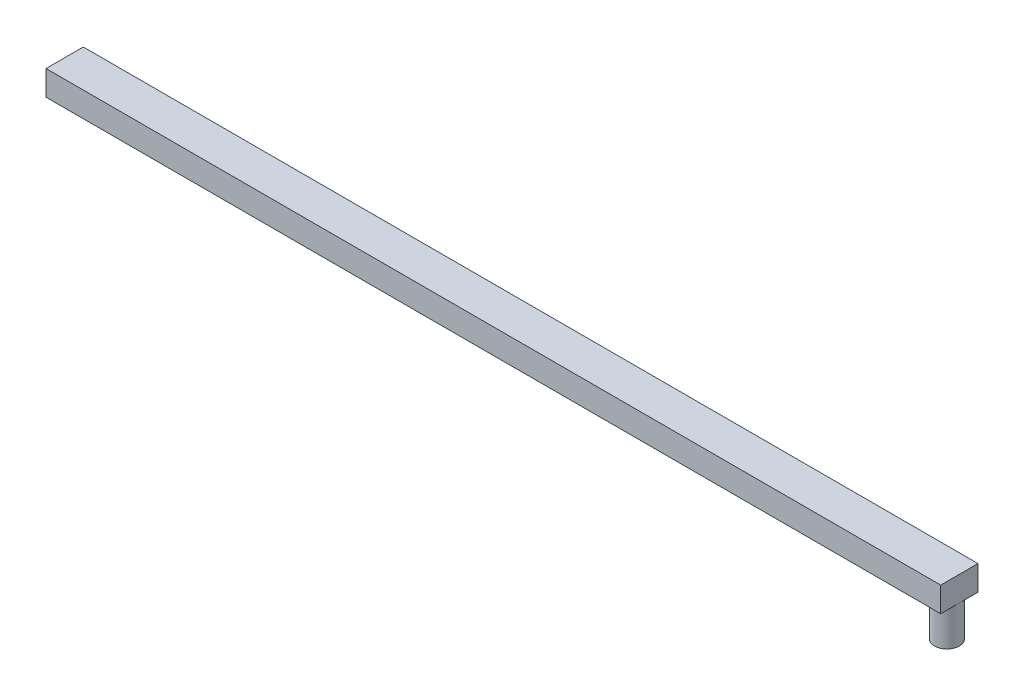
ISO-10303-21;
HEADER;
FILE_DESCRIPTION(('STEP AP214'),'2;1');
FILE_NAME('part.step','',(''),(''),'','','');
FILE_SCHEMA(('AUTOMOTIVE_DESIGN { 1 0 10303 214 1 1 1 1 }'));
ENDSEC;
DATA;
#1=APPLICATION_CONTEXT('core data for automotive mechanical design processes');
#2=APPLICATION_PROTOCOL_DEFINITION('international standard','automotive_design',2000,#1);
#3=PRODUCT_CONTEXT('',#1,'mechanical');
#4=PRODUCT('Part','Part','',(#3));
#5=PRODUCT_RELATED_PRODUCT_CATEGORY('part','',(#4));
#6=PRODUCT_DEFINITION_FORMATION('','',#4);
#7=PRODUCT_DEFINITION_CONTEXT('part definition',#1,'design');
#8=PRODUCT_DEFINITION('design','',#6,#7);
#9=PRODUCT_DEFINITION_SHAPE('','',#8);
#10=(LENGTH_UNIT() NAMED_UNIT(*) SI_UNIT(.MILLI.,.METRE.));
#11=(NAMED_UNIT(*) PLANE_ANGLE_UNIT() SI_UNIT($,.RADIAN.));
#12=(NAMED_UNIT(*) SI_UNIT($,.STERADIAN.) SOLID_ANGLE_UNIT());
#13=UNCERTAINTY_MEASURE_WITH_UNIT(LENGTH_MEASURE(1.E-05),#10,'distance_accuracy_value','');
#14=(GEOMETRIC_REPRESENTATION_CONTEXT(3) GLOBAL_UNCERTAINTY_ASSIGNED_CONTEXT((#13)) GLOBAL_UNIT_ASSIGNED_CONTEXT((#10,
#11,#12)) REPRESENTATION_CONTEXT('',''));
#15=CARTESIAN_POINT('',(0.,0.,0.));
#16=DIRECTION('',(0.,0.,1.));
#17=DIRECTION('',(1.,0.,0.));
#18=AXIS2_PLACEMENT_3D('',#15,#16,#17);
#19=CARTESIAN_POINT('',(0.,3.,0.));
#20=DIRECTION('',(0.,-1.,0.));
#21=DIRECTION('',(0.,0.,-1.));
#22=AXIS2_PLACEMENT_3D('',#19,#20,#21);
#23=CYLINDRICAL_SURFACE('',#22,1.);
#24=CARTESIAN_POINT('',(0.,3.,0.));
#25=DIRECTION('',(0.,1.,0.));
#26=DIRECTION('',(0.,0.,1.));
#27=AXIS2_PLACEMENT_3D('',#24,#25,#26);
#28=CIRCLE('',#27,1.);
#29=CARTESIAN_POINT('',(1.,3.,0.));
#30=VERTEX_POINT('',#29);
#31=EDGE_CURVE('E11',#30,#30,#28,.T.);
#32=ORIENTED_EDGE('',*,*,#31,.F.);
#33=EDGE_LOOP('',(#32));
#34=FACE_BOUND('',#33,.T.);
#35=CARTESIAN_POINT('',(0.,0.,0.));
#36=DIRECTION('',(0.,1.,0.));
#37=DIRECTION('',(0.,0.,1.));
#38=AXIS2_PLACEMENT_3D('',#35,#36,#37);
#39=CIRCLE('',#38,1.);
#40=CARTESIAN_POINT('',(0.,0.,1.));
#41=VERTEX_POINT('',#40);
#42=EDGE_CURVE('E36',#41,#41,#39,.T.);
#43=ORIENTED_EDGE('',*,*,#42,.T.);
#44=EDGE_LOOP('',(#43));
#45=FACE_BOUND('',#44,.T.);
#46=ADVANCED_FACE('F33',(#34,#45),#23,.T.);
#47=CARTESIAN_POINT('',(0.,0.,0.));
#48=DIRECTION('',(0.,1.,0.));
#49=DIRECTION('',(0.,0.,1.));
#50=AXIS2_PLACEMENT_3D('',#47,#48,#49);
#51=PLANE('',#50);
#52=ORIENTED_EDGE('',*,*,#42,.F.);
#53=EDGE_LOOP('',(#52));
#54=FACE_BOUND('',#53,.T.);
#55=ADVANCED_FACE('F118',(#54),#51,.F.);
#56=CARTESIAN_POINT('',(1.,5.,-1.5));
#57=DIRECTION('',(-1.,0.,0.));
#58=DIRECTION('',(0.,0.,1.));
#59=AXIS2_PLACEMENT_3D('',#56,#57,#58);
#60=PLANE('',#59);
#61=DIRECTION('',(0.,0.,-1.));
#62=VECTOR('',#61,1.);
#63=CARTESIAN_POINT('',(1.,3.,-1.5));
#64=LINE('',#63,#62);
#65=CARTESIAN_POINT('',(1.,3.,1.5));
#66=VERTEX_POINT('',#65);
#67=EDGE_CURVE('E104',#66,#30,#64,.T.);
#68=ORIENTED_EDGE('',*,*,#67,.T.);
#69=CARTESIAN_POINT('',(1.,3.,-1.5));
#70=VERTEX_POINT('',#69);
#71=EDGE_CURVE('E107',#30,#70,#64,.T.);
#72=ORIENTED_EDGE('',*,*,#71,.T.);
#73=DIRECTION('',(0.,-1.,0.));
#74=VECTOR('',#73,1.);
#75=CARTESIAN_POINT('',(1.,5.,-1.5));
#76=LINE('',#75,#74);
#77=CARTESIAN_POINT('',(1.,5.,-1.5));
#78=VERTEX_POINT('',#77);
#79=EDGE_CURVE('E95',#78,#70,#76,.T.);
#80=ORIENTED_EDGE('',*,*,#79,.F.);
#81=DIRECTION('',(0.,0.,-1.));
#82=VECTOR('',#81,1.);
#83=CARTESIAN_POINT('',(1.,5.,-1.5));
#84=LINE('',#83,#82);
#85=CARTESIAN_POINT('',(1.,5.,1.5));
#86=VERTEX_POINT('',#85);
#87=EDGE_CURVE('E85',#86,#78,#84,.T.);
#88=ORIENTED_EDGE('',*,*,#87,.F.);
#89=DIRECTION('',(0.,-1.,0.));
#90=VECTOR('',#89,1.);
#91=CARTESIAN_POINT('',(1.,5.,1.5));
#92=LINE('',#91,#90);
#93=EDGE_CURVE('E100',#86,#66,#92,.T.);
#94=ORIENTED_EDGE('',*,*,#93,.T.);
#95=EDGE_LOOP('',(#68,#72,#80,#88,#94));
#96=FACE_BOUND('',#95,.T.);
#97=ADVANCED_FACE('F120',(#96),#60,.F.);
#98=CARTESIAN_POINT('',(1.,5.,-1.5));
#99=DIRECTION('',(0.,0.,1.));
#100=DIRECTION('',(1.,0.,0.));
#101=AXIS2_PLACEMENT_3D('',#98,#99,#100);
#102=PLANE('',#101);
#103=DIRECTION('',(-1.,0.,0.));
#104=VECTOR('',#103,1.);
#105=CARTESIAN_POINT('',(1.,3.,-1.5));
#106=LINE('',#105,#104);
#107=CARTESIAN_POINT('',(-71.,3.,-1.49999999999999));
#108=VERTEX_POINT('',#107);
#109=EDGE_CURVE('E92',#70,#108,#106,.T.);
#110=ORIENTED_EDGE('',*,*,#109,.T.);
#111=DIRECTION('',(0.,-1.,0.));
#112=VECTOR('',#111,1.);
#113=CARTESIAN_POINT('',(-71.,5.,-1.49999999999999));
#114=LINE('',#113,#112);
#115=CARTESIAN_POINT('',(-71.,5.,-1.49999999999999));
#116=VERTEX_POINT('',#115);
#117=EDGE_CURVE('E89',#116,#108,#114,.T.);
#118=ORIENTED_EDGE('',*,*,#117,.F.);
#119=DIRECTION('',(-1.,0.,0.));
#120=VECTOR('',#119,1.);
#121=CARTESIAN_POINT('',(1.,5.,-1.5));
#122=LINE('',#121,#120);
#123=EDGE_CURVE('E79',#78,#116,#122,.T.);
#124=ORIENTED_EDGE('',*,*,#123,.F.);
#125=ORIENTED_EDGE('',*,*,#79,.T.);
#126=EDGE_LOOP('',(#110,#118,#124,#125));
#127=FACE_BOUND('',#126,.T.);
#128=ADVANCED_FACE('F90',(#127),#102,.F.);
#129=CARTESIAN_POINT('',(-71.,5.,-1.49999999999999));
#130=DIRECTION('',(1.,0.,0.));
#131=DIRECTION('',(0.,0.,-1.));
#132=AXIS2_PLACEMENT_3D('',#129,#130,#131);
#133=PLANE('',#132);
#134=DIRECTION('',(0.,0.,1.));
#135=VECTOR('',#134,1.);
#136=CARTESIAN_POINT('',(-71.,3.,-1.49999999999999));
#137=LINE('',#136,#135);
#138=CARTESIAN_POINT('',(-71.,3.,1.49999999999999));
#139=VERTEX_POINT('',#138);
#140=EDGE_CURVE('E109',#108,#139,#137,.T.);
#141=ORIENTED_EDGE('',*,*,#140,.T.);
#142=DIRECTION('',(0.,-1.,0.));
#143=VECTOR('',#142,1.);
#144=CARTESIAN_POINT('',(-71.,5.,1.49999999999999));
#145=LINE('',#144,#143);
#146=CARTESIAN_POINT('',(-71.,5.,1.49999999999999));
#147=VERTEX_POINT('',#146);
#148=EDGE_CURVE('E96',#147,#139,#145,.T.);
#149=ORIENTED_EDGE('',*,*,#148,.F.);
#150=DIRECTION('',(0.,0.,1.));
#151=VECTOR('',#150,1.);
#152=CARTESIAN_POINT('',(-71.,5.,-1.49999999999999));
#153=LINE('',#152,#151);
#154=EDGE_CURVE('E82',#116,#147,#153,.T.);
#155=ORIENTED_EDGE('',*,*,#154,.F.);
#156=ORIENTED_EDGE('',*,*,#117,.T.);
#157=EDGE_LOOP('',(#141,#149,#155,#156));
#158=FACE_BOUND('',#157,.T.);
#159=ADVANCED_FACE('F98',(#158),#133,.F.);
#160=CARTESIAN_POINT('',(1.,5.,1.5));
#161=DIRECTION('',(0.,0.,-1.));
#162=DIRECTION('',(-1.,0.,0.));
#163=AXIS2_PLACEMENT_3D('',#160,#161,#162);
#164=PLANE('',#163);
#165=DIRECTION('',(1.,0.,0.));
#166=VECTOR('',#165,1.);
#167=CARTESIAN_POINT('',(1.,3.,1.5));
#168=LINE('',#167,#166);
#169=EDGE_CURVE('E71',#139,#66,#168,.T.);
#170=ORIENTED_EDGE('',*,*,#169,.T.);
#171=ORIENTED_EDGE('',*,*,#93,.F.);
#172=DIRECTION('',(1.,0.,0.));
#173=VECTOR('',#172,1.);
#174=CARTESIAN_POINT('',(1.,5.,1.5));
#175=LINE('',#174,#173);
#176=EDGE_CURVE('E51',#147,#86,#175,.T.);
#177=ORIENTED_EDGE('',*,*,#176,.F.);
#178=ORIENTED_EDGE('',*,*,#148,.T.);
#179=EDGE_LOOP('',(#170,#171,#177,#178));
#180=FACE_BOUND('',#179,.T.);
#181=ADVANCED_FACE('F132',(#180),#164,.F.);
#182=CARTESIAN_POINT('',(0.,5.,0.));
#183=DIRECTION('',(0.,-1.,0.));
#184=DIRECTION('',(0.,0.,-1.));
#185=AXIS2_PLACEMENT_3D('',#182,#183,#184);
#186=PLANE('',#185);
#187=ORIENTED_EDGE('',*,*,#87,.T.);
#188=ORIENTED_EDGE('',*,*,#123,.T.);
#189=ORIENTED_EDGE('',*,*,#154,.T.);
#190=ORIENTED_EDGE('',*,*,#176,.T.);
#191=EDGE_LOOP('',(#187,#188,#189,#190));
#192=FACE_BOUND('',#191,.T.);
#193=ADVANCED_FACE('F80',(#192),#186,.F.);
#194=CARTESIAN_POINT('',(0.,3.,0.));
#195=DIRECTION('',(0.,-1.,0.));
#196=DIRECTION('',(0.,0.,-1.));
#197=AXIS2_PLACEMENT_3D('',#194,#195,#196);
#198=PLANE('',#197);
#199=CARTESIAN_POINT('',(-70.,3.,0.));
#200=DIRECTION('',(0.,-1.,0.));
#201=DIRECTION('',(0.,0.,-1.));
#202=AXIS2_PLACEMENT_3D('',#199,#200,#201);
#203=CIRCLE('',#202,0.499999999999999);
#204=CARTESIAN_POINT('',(-70.,3.,-0.499999999999999));
#205=VERTEX_POINT('',#204);
#206=EDGE_CURVE('E153',#205,#205,#203,.T.);
#207=ORIENTED_EDGE('',*,*,#206,.F.);
#208=EDGE_LOOP('',(#207));
#209=FACE_BOUND('',#208,.T.);
#210=ORIENTED_EDGE('',*,*,#71,.F.);
#211=ORIENTED_EDGE('',*,*,#31,.T.);
#212=ORIENTED_EDGE('',*,*,#67,.F.);
#213=ORIENTED_EDGE('',*,*,#169,.F.);
#214=ORIENTED_EDGE('',*,*,#140,.F.);
#215=ORIENTED_EDGE('',*,*,#109,.F.);
#216=EDGE_LOOP('',(#210,#211,#212,#213,#214,#215));
#217=FACE_BOUND('',#216,.T.);
#218=ADVANCED_FACE('F135',(#209,#217),#198,.T.);
#219=CARTESIAN_POINT('',(-70.,4.,0.));
#220=DIRECTION('',(0.,-1.,0.));
#221=DIRECTION('',(0.,0.,-1.));
#222=AXIS2_PLACEMENT_3D('',#219,#220,#221);
#223=CYLINDRICAL_SURFACE('',#222,0.499999999999999);
#224=CARTESIAN_POINT('',(-70.,4.,0.));
#225=DIRECTION('',(0.,-1.,0.));
#226=DIRECTION('',(0.,0.,-1.));
#227=AXIS2_PLACEMENT_3D('',#224,#225,#226);
#228=CIRCLE('',#227,0.499999999999999);
#229=CARTESIAN_POINT('',(-70.,4.,-0.499999999999999));
#230=VERTEX_POINT('',#229);
#231=EDGE_CURVE('E152',#230,#230,#228,.T.);
#232=ORIENTED_EDGE('',*,*,#231,.F.);
#233=EDGE_LOOP('',(#232));
#234=FACE_BOUND('',#233,.T.);
#235=ORIENTED_EDGE('',*,*,#206,.T.);
#236=EDGE_LOOP('',(#235));
#237=FACE_BOUND('',#236,.T.);
#238=ADVANCED_FACE('F138',(#234,#237),#223,.F.);
#239=CARTESIAN_POINT('',(-70.,4.,0.));
#240=DIRECTION('',(0.,-1.,0.));
#241=DIRECTION('',(0.,0.,-1.));
#242=AXIS2_PLACEMENT_3D('',#239,#240,#241);
#243=PLANE('',#242);
#244=ORIENTED_EDGE('',*,*,#231,.T.);
#245=EDGE_LOOP('',(#244));
#246=FACE_BOUND('',#245,.T.);
#247=ADVANCED_FACE('F144',(#246),#243,.T.);
#248=CLOSED_SHELL('',(#46,#55,#97,#128,#159,#181,#193,#218,#238,#247));
#249=MANIFOLD_SOLID_BREP('B2',#248);
#250=ADVANCED_BREP_SHAPE_REPRESENTATION('',(#18,#249),#14);
#251=SHAPE_DEFINITION_REPRESENTATION(#9,#250);
ENDSEC;
END-ISO-10303-21;
